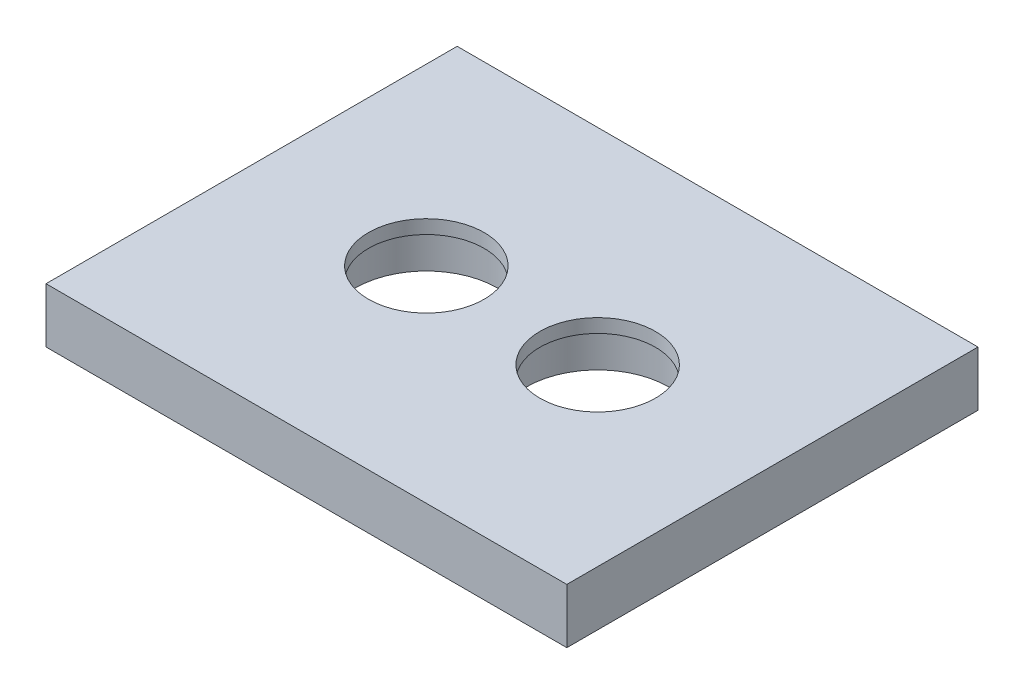
ISO-10303-21;
HEADER;
FILE_DESCRIPTION(('STEP AP214'),'2;1');
FILE_NAME('part.step','',(''),(''),'','','');
FILE_SCHEMA(('AUTOMOTIVE_DESIGN { 1 0 10303 214 1 1 1 1 }'));
ENDSEC;
DATA;
#1=APPLICATION_CONTEXT('core data for automotive mechanical design processes');
#2=APPLICATION_PROTOCOL_DEFINITION('international standard','automotive_design',2000,#1);
#3=PRODUCT_CONTEXT('',#1,'mechanical');
#4=PRODUCT('Part','Part','',(#3));
#5=PRODUCT_RELATED_PRODUCT_CATEGORY('part','',(#4));
#6=PRODUCT_DEFINITION_FORMATION('','',#4);
#7=PRODUCT_DEFINITION_CONTEXT('part definition',#1,'design');
#8=PRODUCT_DEFINITION('design','',#6,#7);
#9=PRODUCT_DEFINITION_SHAPE('','',#8);
#10=(LENGTH_UNIT() NAMED_UNIT(*) SI_UNIT(.MILLI.,.METRE.));
#11=(NAMED_UNIT(*) PLANE_ANGLE_UNIT() SI_UNIT($,.RADIAN.));
#12=(NAMED_UNIT(*) SI_UNIT($,.STERADIAN.) SOLID_ANGLE_UNIT());
#13=UNCERTAINTY_MEASURE_WITH_UNIT(LENGTH_MEASURE(1.E-05),#10,'distance_accuracy_value','');
#14=(GEOMETRIC_REPRESENTATION_CONTEXT(3) GLOBAL_UNCERTAINTY_ASSIGNED_CONTEXT((#13)) GLOBAL_UNIT_ASSIGNED_CONTEXT((#10,
#11,#12)) REPRESENTATION_CONTEXT('',''));
#15=CARTESIAN_POINT('',(0.,0.,0.));
#16=DIRECTION('',(0.,0.,1.));
#17=DIRECTION('',(1.,0.,0.));
#18=AXIS2_PLACEMENT_3D('',#15,#16,#17);
#19=CARTESIAN_POINT('',(31.25,-0.001000000000001,0.));
#20=DIRECTION('',(0.,1.,0.));
#21=DIRECTION('',(0.,0.,1.));
#22=AXIS2_PLACEMENT_3D('',#19,#20,#21);
#23=CYLINDRICAL_SURFACE('',#22,26.);
#24=CARTESIAN_POINT('',(31.25,0.,0.));
#25=DIRECTION('',(0.,-1.,0.));
#26=DIRECTION('',(0.,0.,-1.));
#27=AXIS2_PLACEMENT_3D('',#24,#25,#26);
#28=CIRCLE('',#27,26.);
#29=CARTESIAN_POINT('',(31.25,0.,-26.));
#30=VERTEX_POINT('',#29);
#31=EDGE_CURVE('E106',#30,#30,#28,.F.);
#32=ORIENTED_EDGE('',*,*,#31,.F.);
#33=EDGE_LOOP('',(#32));
#34=FACE_BOUND('',#33,.T.);
#35=CARTESIAN_POINT('',(31.25,15.,0.));
#36=DIRECTION('',(0.,1.,0.));
#37=DIRECTION('',(0.,0.,1.));
#38=AXIS2_PLACEMENT_3D('',#35,#36,#37);
#39=CIRCLE('',#38,26.);
#40=CARTESIAN_POINT('',(31.25,15.,26.));
#41=VERTEX_POINT('',#40);
#42=EDGE_CURVE('E11',#41,#41,#39,.F.);
#43=ORIENTED_EDGE('',*,*,#42,.F.);
#44=EDGE_LOOP('',(#43));
#45=FACE_BOUND('',#44,.T.);
#46=ADVANCED_FACE('F34',(#34,#45),#23,.F.);
#47=CARTESIAN_POINT('',(-31.25,-0.001000000000001,0.));
#48=DIRECTION('',(0.,1.,0.));
#49=DIRECTION('',(0.,0.,1.));
#50=AXIS2_PLACEMENT_3D('',#47,#48,#49);
#51=CYLINDRICAL_SURFACE('',#50,26.);
#52=CARTESIAN_POINT('',(-31.25,0.,0.));
#53=DIRECTION('',(0.,-1.,0.));
#54=DIRECTION('',(0.,0.,-1.));
#55=AXIS2_PLACEMENT_3D('',#52,#53,#54);
#56=CIRCLE('',#55,26.);
#57=CARTESIAN_POINT('',(-31.25,0.,-26.));
#58=VERTEX_POINT('',#57);
#59=EDGE_CURVE('E248',#58,#58,#56,.F.);
#60=ORIENTED_EDGE('',*,*,#59,.F.);
#61=EDGE_LOOP('',(#60));
#62=FACE_BOUND('',#61,.T.);
#63=CARTESIAN_POINT('',(-31.25,15.,0.));
#64=DIRECTION('',(0.,1.,0.));
#65=DIRECTION('',(0.,0.,1.));
#66=AXIS2_PLACEMENT_3D('',#63,#64,#65);
#67=CIRCLE('',#66,26.);
#68=CARTESIAN_POINT('',(-31.25,15.,26.));
#69=VERTEX_POINT('',#68);
#70=EDGE_CURVE('E43',#69,#69,#67,.F.);
#71=ORIENTED_EDGE('',*,*,#70,.F.);
#72=EDGE_LOOP('',(#71));
#73=FACE_BOUND('',#72,.T.);
#74=ADVANCED_FACE('F117',(#62,#73),#51,.F.);
#75=CARTESIAN_POINT('',(95.,20.,75.));
#76=DIRECTION('',(-1.,0.,0.));
#77=DIRECTION('',(0.,0.,1.));
#78=AXIS2_PLACEMENT_3D('',#75,#76,#77);
#79=PLANE('',#78);
#80=DIRECTION('',(0.,0.,-1.));
#81=VECTOR('',#80,1.);
#82=CARTESIAN_POINT('',(95.,0.,75.));
#83=LINE('',#82,#81);
#84=CARTESIAN_POINT('',(95.,0.,75.));
#85=VERTEX_POINT('',#84);
#86=CARTESIAN_POINT('',(95.,0.,-75.));
#87=VERTEX_POINT('',#86);
#88=EDGE_CURVE('E103',#85,#87,#83,.T.);
#89=ORIENTED_EDGE('',*,*,#88,.T.);
#90=DIRECTION('',(0.,-1.,0.));
#91=VECTOR('',#90,1.);
#92=CARTESIAN_POINT('',(95.,20.,-75.));
#93=LINE('',#92,#91);
#94=CARTESIAN_POINT('',(95.,20.,-75.));
#95=VERTEX_POINT('',#94);
#96=EDGE_CURVE('E94',#95,#87,#93,.T.);
#97=ORIENTED_EDGE('',*,*,#96,.F.);
#98=DIRECTION('',(0.,0.,-1.));
#99=VECTOR('',#98,1.);
#100=CARTESIAN_POINT('',(95.,20.,75.));
#101=LINE('',#100,#99);
#102=CARTESIAN_POINT('',(95.,20.,75.));
#103=VERTEX_POINT('',#102);
#104=EDGE_CURVE('E88',#103,#95,#101,.T.);
#105=ORIENTED_EDGE('',*,*,#104,.F.);
#106=DIRECTION('',(0.,-1.,0.));
#107=VECTOR('',#106,1.);
#108=CARTESIAN_POINT('',(95.,20.,75.));
#109=LINE('',#108,#107);
#110=EDGE_CURVE('E99',#103,#85,#109,.T.);
#111=ORIENTED_EDGE('',*,*,#110,.T.);
#112=EDGE_LOOP('',(#89,#97,#105,#111));
#113=FACE_BOUND('',#112,.T.);
#114=ADVANCED_FACE('F36',(#113),#79,.F.);
#115=CARTESIAN_POINT('',(-95.,20.,-75.));
#116=DIRECTION('',(0.,0.,1.));
#117=DIRECTION('',(1.,0.,0.));
#118=AXIS2_PLACEMENT_3D('',#115,#116,#117);
#119=PLANE('',#118);
#120=DIRECTION('',(-1.,0.,0.));
#121=VECTOR('',#120,1.);
#122=CARTESIAN_POINT('',(-95.,0.,-75.));
#123=LINE('',#122,#121);
#124=CARTESIAN_POINT('',(-95.,0.,-75.));
#125=VERTEX_POINT('',#124);
#126=EDGE_CURVE('E93',#87,#125,#123,.T.);
#127=ORIENTED_EDGE('',*,*,#126,.T.);
#128=DIRECTION('',(0.,-1.,0.));
#129=VECTOR('',#128,1.);
#130=CARTESIAN_POINT('',(-95.,20.,-75.));
#131=LINE('',#130,#129);
#132=CARTESIAN_POINT('',(-95.,20.,-75.));
#133=VERTEX_POINT('',#132);
#134=EDGE_CURVE('E91',#133,#125,#131,.T.);
#135=ORIENTED_EDGE('',*,*,#134,.F.);
#136=DIRECTION('',(-1.,0.,0.));
#137=VECTOR('',#136,1.);
#138=CARTESIAN_POINT('',(-95.,20.,-75.));
#139=LINE('',#138,#137);
#140=EDGE_CURVE('E82',#95,#133,#139,.T.);
#141=ORIENTED_EDGE('',*,*,#140,.F.);
#142=ORIENTED_EDGE('',*,*,#96,.T.);
#143=EDGE_LOOP('',(#127,#135,#141,#142));
#144=FACE_BOUND('',#143,.T.);
#145=ADVANCED_FACE('F92',(#144),#119,.F.);
#146=CARTESIAN_POINT('',(-95.,20.,75.));
#147=DIRECTION('',(1.,0.,0.));
#148=DIRECTION('',(0.,0.,-1.));
#149=AXIS2_PLACEMENT_3D('',#146,#147,#148);
#150=PLANE('',#149);
#151=DIRECTION('',(0.,0.,1.));
#152=VECTOR('',#151,1.);
#153=CARTESIAN_POINT('',(-95.,0.,75.));
#154=LINE('',#153,#152);
#155=CARTESIAN_POINT('',(-95.,0.,75.));
#156=VERTEX_POINT('',#155);
#157=EDGE_CURVE('E68',#125,#156,#154,.T.);
#158=ORIENTED_EDGE('',*,*,#157,.T.);
#159=DIRECTION('',(0.,-1.,0.));
#160=VECTOR('',#159,1.);
#161=CARTESIAN_POINT('',(-95.,20.,75.));
#162=LINE('',#161,#160);
#163=CARTESIAN_POINT('',(-95.,20.,75.));
#164=VERTEX_POINT('',#163);
#165=EDGE_CURVE('E95',#164,#156,#162,.T.);
#166=ORIENTED_EDGE('',*,*,#165,.F.);
#167=DIRECTION('',(0.,0.,1.));
#168=VECTOR('',#167,1.);
#169=CARTESIAN_POINT('',(-95.,20.,75.));
#170=LINE('',#169,#168);
#171=EDGE_CURVE('E86',#133,#164,#170,.T.);
#172=ORIENTED_EDGE('',*,*,#171,.F.);
#173=ORIENTED_EDGE('',*,*,#134,.T.);
#174=EDGE_LOOP('',(#158,#166,#172,#173));
#175=FACE_BOUND('',#174,.T.);
#176=ADVANCED_FACE('F97',(#175),#150,.F.);
#177=CARTESIAN_POINT('',(-95.,20.,75.));
#178=DIRECTION('',(0.,0.,-1.));
#179=DIRECTION('',(-1.,0.,0.));
#180=AXIS2_PLACEMENT_3D('',#177,#178,#179);
#181=PLANE('',#180);
#182=DIRECTION('',(1.,0.,0.));
#183=VECTOR('',#182,1.);
#184=CARTESIAN_POINT('',(-95.,0.,75.));
#185=LINE('',#184,#183);
#186=EDGE_CURVE('E74',#156,#85,#185,.T.);
#187=ORIENTED_EDGE('',*,*,#186,.T.);
#188=ORIENTED_EDGE('',*,*,#110,.F.);
#189=DIRECTION('',(1.,0.,0.));
#190=VECTOR('',#189,1.);
#191=CARTESIAN_POINT('',(-95.,20.,75.));
#192=LINE('',#191,#190);
#193=EDGE_CURVE('E51',#164,#103,#192,.T.);
#194=ORIENTED_EDGE('',*,*,#193,.F.);
#195=ORIENTED_EDGE('',*,*,#165,.T.);
#196=EDGE_LOOP('',(#187,#188,#194,#195));
#197=FACE_BOUND('',#196,.T.);
#198=ADVANCED_FACE('F136',(#197),#181,.F.);
#199=CARTESIAN_POINT('',(0.,20.,0.));
#200=DIRECTION('',(0.,-1.,0.));
#201=DIRECTION('',(0.,0.,-1.));
#202=AXIS2_PLACEMENT_3D('',#199,#200,#201);
#203=PLANE('',#202);
#204=ORIENTED_EDGE('',*,*,#104,.T.);
#205=ORIENTED_EDGE('',*,*,#140,.T.);
#206=ORIENTED_EDGE('',*,*,#171,.T.);
#207=ORIENTED_EDGE('',*,*,#193,.T.);
#208=EDGE_LOOP('',(#204,#205,#206,#207));
#209=FACE_BOUND('',#208,.T.);
#210=CARTESIAN_POINT('',(-31.25,20.,0.));
#211=DIRECTION('',(0.,1.,0.));
#212=DIRECTION('',(0.,0.,1.));
#213=AXIS2_PLACEMENT_3D('',#210,#211,#212);
#214=CIRCLE('',#213,21.1);
#215=CARTESIAN_POINT('',(-31.25,20.,21.1));
#216=VERTEX_POINT('',#215);
#217=EDGE_CURVE('E238',#216,#216,#214,.T.);
#218=ORIENTED_EDGE('',*,*,#217,.F.);
#219=EDGE_LOOP('',(#218));
#220=FACE_BOUND('',#219,.T.);
#221=CARTESIAN_POINT('',(31.25,20.,0.));
#222=DIRECTION('',(0.,1.,0.));
#223=DIRECTION('',(0.,0.,1.));
#224=AXIS2_PLACEMENT_3D('',#221,#222,#223);
#225=CIRCLE('',#224,21.1);
#226=CARTESIAN_POINT('',(31.25,20.,21.1));
#227=VERTEX_POINT('',#226);
#228=EDGE_CURVE('E239',#227,#227,#225,.T.);
#229=ORIENTED_EDGE('',*,*,#228,.F.);
#230=EDGE_LOOP('',(#229));
#231=FACE_BOUND('',#230,.T.);
#232=ADVANCED_FACE('F83',(#209,#220,#231),#203,.F.);
#233=CARTESIAN_POINT('',(0.,0.,0.));
#234=DIRECTION('',(0.,-1.,0.));
#235=DIRECTION('',(0.,0.,-1.));
#236=AXIS2_PLACEMENT_3D('',#233,#234,#235);
#237=PLANE('',#236);
#238=ORIENTED_EDGE('',*,*,#59,.T.);
#239=EDGE_LOOP('',(#238));
#240=FACE_BOUND('',#239,.T.);
#241=ORIENTED_EDGE('',*,*,#31,.T.);
#242=EDGE_LOOP('',(#241));
#243=FACE_BOUND('',#242,.T.);
#244=ORIENTED_EDGE('',*,*,#88,.F.);
#245=ORIENTED_EDGE('',*,*,#186,.F.);
#246=ORIENTED_EDGE('',*,*,#157,.F.);
#247=ORIENTED_EDGE('',*,*,#126,.F.);
#248=EDGE_LOOP('',(#244,#245,#246,#247));
#249=FACE_BOUND('',#248,.T.);
#250=ADVANCED_FACE('F135',(#240,#243,#249),#237,.T.);
#251=CARTESIAN_POINT('',(-31.25,15.,0.));
#252=DIRECTION('',(0.,1.,0.));
#253=DIRECTION('',(0.,0.,1.));
#254=AXIS2_PLACEMENT_3D('',#251,#252,#253);
#255=CYLINDRICAL_SURFACE('',#254,21.1);
#256=CARTESIAN_POINT('',(-31.25,15.,0.));
#257=DIRECTION('',(0.,1.,0.));
#258=DIRECTION('',(0.,0.,1.));
#259=AXIS2_PLACEMENT_3D('',#256,#257,#258);
#260=CIRCLE('',#259,21.1);
#261=CARTESIAN_POINT('',(-31.25,15.,21.1));
#262=VERTEX_POINT('',#261);
#263=EDGE_CURVE('E242',#262,#262,#260,.T.);
#264=ORIENTED_EDGE('',*,*,#263,.F.);
#265=EDGE_LOOP('',(#264));
#266=FACE_BOUND('',#265,.T.);
#267=ORIENTED_EDGE('',*,*,#217,.T.);
#268=EDGE_LOOP('',(#267));
#269=FACE_BOUND('',#268,.T.);
#270=ADVANCED_FACE('F130',(#266,#269),#255,.F.);
#271=CARTESIAN_POINT('',(0.,15.,0.));
#272=DIRECTION('',(0.,1.,0.));
#273=DIRECTION('',(0.,0.,1.));
#274=AXIS2_PLACEMENT_3D('',#271,#272,#273);
#275=PLANE('',#274);
#276=ORIENTED_EDGE('',*,*,#263,.T.);
#277=EDGE_LOOP('',(#276));
#278=FACE_BOUND('',#277,.T.);
#279=ORIENTED_EDGE('',*,*,#70,.T.);
#280=EDGE_LOOP('',(#279));
#281=FACE_BOUND('',#280,.T.);
#282=ADVANCED_FACE('F115',(#278,#281),#275,.F.);
#283=CARTESIAN_POINT('',(31.25,15.,0.));
#284=DIRECTION('',(0.,1.,0.));
#285=DIRECTION('',(0.,0.,1.));
#286=AXIS2_PLACEMENT_3D('',#283,#284,#285);
#287=CYLINDRICAL_SURFACE('',#286,21.1);
#288=CARTESIAN_POINT('',(31.25,15.,0.));
#289=DIRECTION('',(0.,1.,0.));
#290=DIRECTION('',(0.,0.,1.));
#291=AXIS2_PLACEMENT_3D('',#288,#289,#290);
#292=CIRCLE('',#291,21.1);
#293=CARTESIAN_POINT('',(31.25,15.,21.1));
#294=VERTEX_POINT('',#293);
#295=EDGE_CURVE('E235',#294,#294,#292,.T.);
#296=ORIENTED_EDGE('',*,*,#295,.F.);
#297=EDGE_LOOP('',(#296));
#298=FACE_BOUND('',#297,.T.);
#299=ORIENTED_EDGE('',*,*,#228,.T.);
#300=EDGE_LOOP('',(#299));
#301=FACE_BOUND('',#300,.T.);
#302=ADVANCED_FACE('F177',(#298,#301),#287,.F.);
#303=CARTESIAN_POINT('',(0.,15.,0.));
#304=DIRECTION('',(0.,1.,0.));
#305=DIRECTION('',(0.,0.,1.));
#306=AXIS2_PLACEMENT_3D('',#303,#304,#305);
#307=PLANE('',#306);
#308=ORIENTED_EDGE('',*,*,#295,.T.);
#309=EDGE_LOOP('',(#308));
#310=FACE_BOUND('',#309,.T.);
#311=ORIENTED_EDGE('',*,*,#42,.T.);
#312=EDGE_LOOP('',(#311));
#313=FACE_BOUND('',#312,.T.);
#314=ADVANCED_FACE('F184',(#310,#313),#307,.F.);
#315=CLOSED_SHELL('',(#46,#74,#114,#145,#176,#198,#232,#250,#270,#282,#302,#314));
#316=MANIFOLD_SOLID_BREP('B2',#315);
#317=ADVANCED_BREP_SHAPE_REPRESENTATION('',(#18,#316),#14);
#318=SHAPE_DEFINITION_REPRESENTATION(#9,#317);
ENDSEC;
END-ISO-10303-21;
